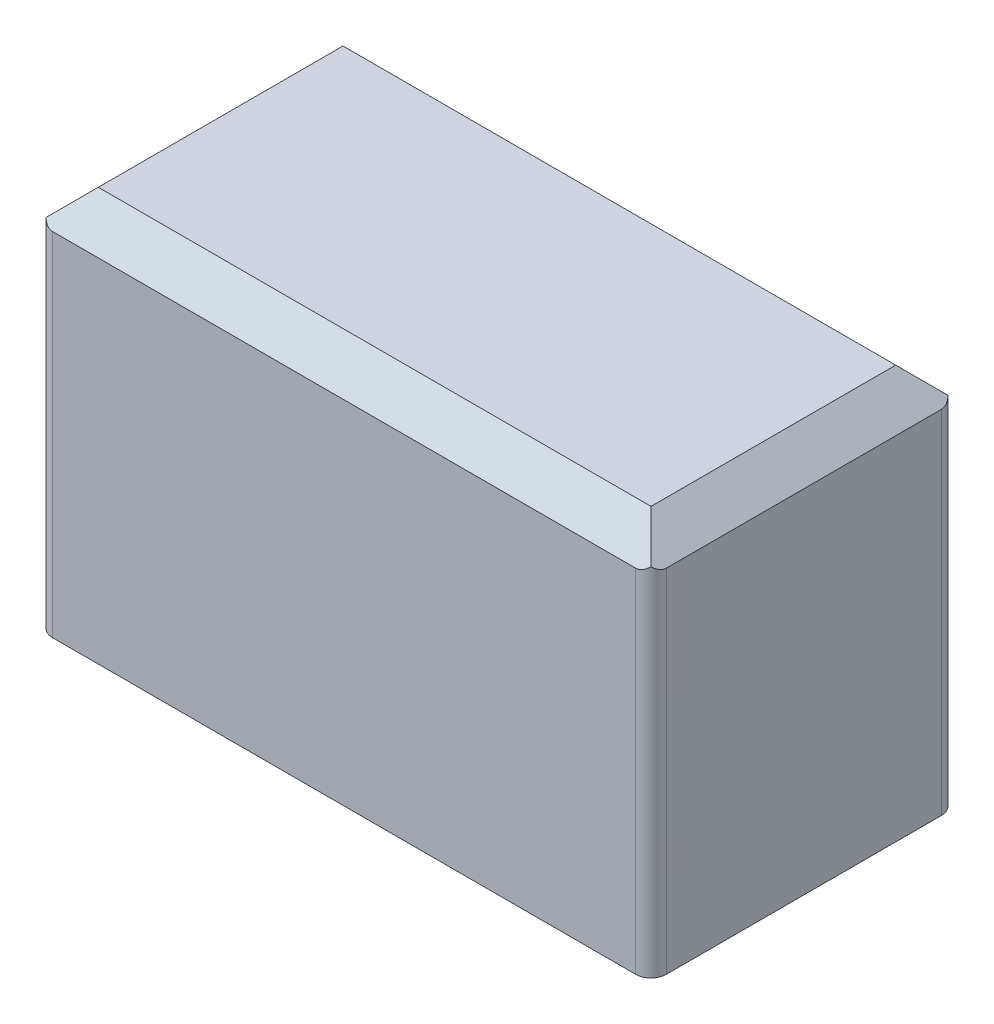
ISO-10303-21;
HEADER;
FILE_DESCRIPTION(('STEP AP214'),'2;1');
FILE_NAME('part.step','',(''),(''),'','','');
FILE_SCHEMA(('AUTOMOTIVE_DESIGN { 1 0 10303 214 1 1 1 1 }'));
ENDSEC;
DATA;
#1=APPLICATION_CONTEXT('core data for automotive mechanical design processes');
#2=APPLICATION_PROTOCOL_DEFINITION('international standard','automotive_design',2000,#1);
#3=PRODUCT_CONTEXT('',#1,'mechanical');
#4=PRODUCT('Part','Part','',(#3));
#5=PRODUCT_RELATED_PRODUCT_CATEGORY('part','',(#4));
#6=PRODUCT_DEFINITION_FORMATION('','',#4);
#7=PRODUCT_DEFINITION_CONTEXT('part definition',#1,'design');
#8=PRODUCT_DEFINITION('design','',#6,#7);
#9=PRODUCT_DEFINITION_SHAPE('','',#8);
#10=(LENGTH_UNIT() NAMED_UNIT(*) SI_UNIT(.MILLI.,.METRE.));
#11=(NAMED_UNIT(*) PLANE_ANGLE_UNIT() SI_UNIT($,.RADIAN.));
#12=(NAMED_UNIT(*) SI_UNIT($,.STERADIAN.) SOLID_ANGLE_UNIT());
#13=UNCERTAINTY_MEASURE_WITH_UNIT(LENGTH_MEASURE(1.E-05),#10,'distance_accuracy_value','');
#14=(GEOMETRIC_REPRESENTATION_CONTEXT(3) GLOBAL_UNCERTAINTY_ASSIGNED_CONTEXT((#13)) GLOBAL_UNIT_ASSIGNED_CONTEXT((#10,
#11,#12)) REPRESENTATION_CONTEXT('',''));
#15=CARTESIAN_POINT('',(0.,0.,0.));
#16=DIRECTION('',(0.,0.,1.));
#17=DIRECTION('',(1.,0.,0.));
#18=AXIS2_PLACEMENT_3D('',#15,#16,#17);
#19=CARTESIAN_POINT('',(0.,25.,0.));
#20=DIRECTION('',(1.,0.,0.));
#21=DIRECTION('',(0.,0.,-1.));
#22=AXIS2_PLACEMENT_3D('',#19,#20,#21);
#23=PLANE('',#22);
#24=DIRECTION('',(0.,0.,1.));
#25=VECTOR('',#24,1.);
#26=CARTESIAN_POINT('',(0.,0.,0.));
#27=LINE('',#26,#25);
#28=CARTESIAN_POINT('',(0.,0.,-19.));
#29=VERTEX_POINT('',#28);
#30=CARTESIAN_POINT('',(0.,0.,-1.));
#31=VERTEX_POINT('',#30);
#32=EDGE_CURVE('E181',#29,#31,#27,.T.);
#33=ORIENTED_EDGE('',*,*,#32,.T.);
#34=DIRECTION('',(0.,-1.,0.));
#35=VECTOR('',#34,1.);
#36=CARTESIAN_POINT('',(0.,25.,-1.));
#37=LINE('',#36,#35);
#38=CARTESIAN_POINT('',(0.,23.,-1.));
#39=VERTEX_POINT('',#38);
#40=EDGE_CURVE('E196',#31,#39,#37,.F.);
#41=ORIENTED_EDGE('',*,*,#40,.T.);
#42=DIRECTION('',(0.,0.,-1.));
#43=VECTOR('',#42,1.);
#44=CARTESIAN_POINT('',(0.,23.,0.));
#45=LINE('',#44,#43);
#46=CARTESIAN_POINT('',(0.,23.,-19.));
#47=VERTEX_POINT('',#46);
#48=EDGE_CURVE('E174',#39,#47,#45,.T.);
#49=ORIENTED_EDGE('',*,*,#48,.T.);
#50=DIRECTION('',(0.,-1.,0.));
#51=VECTOR('',#50,1.);
#52=CARTESIAN_POINT('',(0.,25.,-19.));
#53=LINE('',#52,#51);
#54=EDGE_CURVE('E192',#47,#29,#53,.T.);
#55=ORIENTED_EDGE('',*,*,#54,.T.);
#56=EDGE_LOOP('',(#33,#41,#49,#55));
#57=FACE_BOUND('',#56,.T.);
#58=ADVANCED_FACE('F38',(#57),#23,.F.);
#59=CARTESIAN_POINT('',(0.,25.,0.));
#60=DIRECTION('',(0.,0.,-1.));
#61=DIRECTION('',(-1.,0.,0.));
#62=AXIS2_PLACEMENT_3D('',#59,#60,#61);
#63=PLANE('',#62);
#64=DIRECTION('',(1.,0.,0.));
#65=VECTOR('',#64,1.);
#66=CARTESIAN_POINT('',(0.,0.,0.));
#67=LINE('',#66,#65);
#68=CARTESIAN_POINT('',(1.,0.,0.));
#69=VERTEX_POINT('',#68);
#70=CARTESIAN_POINT('',(39.1397843102462,0.,0.));
#71=VERTEX_POINT('',#70);
#72=EDGE_CURVE('E164',#69,#71,#67,.T.);
#73=ORIENTED_EDGE('',*,*,#72,.T.);
#74=DIRECTION('',(0.,-1.,0.));
#75=VECTOR('',#74,1.);
#76=CARTESIAN_POINT('',(39.1397843102462,25.,0.));
#77=LINE('',#76,#75);
#78=CARTESIAN_POINT('',(39.1397843102462,23.,0.));
#79=VERTEX_POINT('',#78);
#80=EDGE_CURVE('E226',#71,#79,#77,.F.);
#81=ORIENTED_EDGE('',*,*,#80,.T.);
#82=DIRECTION('',(-1.,0.,0.));
#83=VECTOR('',#82,1.);
#84=CARTESIAN_POINT('',(0.,23.,0.));
#85=LINE('',#84,#83);
#86=CARTESIAN_POINT('',(1.,23.,0.));
#87=VERTEX_POINT('',#86);
#88=EDGE_CURVE('E171',#79,#87,#85,.T.);
#89=ORIENTED_EDGE('',*,*,#88,.T.);
#90=DIRECTION('',(0.,-1.,0.));
#91=VECTOR('',#90,1.);
#92=CARTESIAN_POINT('',(1.,25.,0.));
#93=LINE('',#92,#91);
#94=EDGE_CURVE('E177',#87,#69,#93,.T.);
#95=ORIENTED_EDGE('',*,*,#94,.T.);
#96=EDGE_LOOP('',(#73,#81,#89,#95));
#97=FACE_BOUND('',#96,.T.);
#98=ADVANCED_FACE('F268',(#97),#63,.F.);
#99=CARTESIAN_POINT('',(0.,25.,-20.));
#100=DIRECTION('',(0.,0.,1.));
#101=DIRECTION('',(1.,0.,0.));
#102=AXIS2_PLACEMENT_3D('',#99,#100,#101);
#103=PLANE('',#102);
#104=DIRECTION('',(1.,0.,0.));
#105=VECTOR('',#104,1.);
#106=CARTESIAN_POINT('',(0.,23.,-20.));
#107=LINE('',#106,#105);
#108=CARTESIAN_POINT('',(1.,23.,-20.));
#109=VERTEX_POINT('',#108);
#110=CARTESIAN_POINT('',(39.1397843102462,23.,-20.));
#111=VERTEX_POINT('',#110);
#112=EDGE_CURVE('E140',#109,#111,#107,.T.);
#113=ORIENTED_EDGE('',*,*,#112,.T.);
#114=DIRECTION('',(0.,-1.,0.));
#115=VECTOR('',#114,1.);
#116=CARTESIAN_POINT('',(39.1397843102462,25.,-20.));
#117=LINE('',#116,#115);
#118=CARTESIAN_POINT('',(39.1397843102462,0.,-20.));
#119=VERTEX_POINT('',#118);
#120=EDGE_CURVE('E232',#111,#119,#117,.T.);
#121=ORIENTED_EDGE('',*,*,#120,.T.);
#122=DIRECTION('',(-1.,0.,0.));
#123=VECTOR('',#122,1.);
#124=CARTESIAN_POINT('',(0.,0.,-20.));
#125=LINE('',#124,#123);
#126=CARTESIAN_POINT('',(1.,0.,-20.));
#127=VERTEX_POINT('',#126);
#128=EDGE_CURVE('E159',#119,#127,#125,.T.);
#129=ORIENTED_EDGE('',*,*,#128,.T.);
#130=DIRECTION('',(0.,-1.,0.));
#131=VECTOR('',#130,1.);
#132=CARTESIAN_POINT('',(1.,25.,-20.));
#133=LINE('',#132,#131);
#134=EDGE_CURVE('E209',#127,#109,#133,.F.);
#135=ORIENTED_EDGE('',*,*,#134,.T.);
#136=EDGE_LOOP('',(#113,#121,#129,#135));
#137=FACE_BOUND('',#136,.T.);
#138=ADVANCED_FACE('F292',(#137),#103,.F.);
#139=CARTESIAN_POINT('',(0.,25.,0.));
#140=DIRECTION('',(0.,-1.,0.));
#141=DIRECTION('',(0.,0.,-1.));
#142=AXIS2_PLACEMENT_3D('',#139,#140,#141);
#143=PLANE('',#142);
#144=DIRECTION('',(1.,0.,0.));
#145=VECTOR('',#144,1.);
#146=CARTESIAN_POINT('',(0.,25.,-2.));
#147=LINE('',#146,#145);
#148=CARTESIAN_POINT('',(2.,25.,-2.));
#149=VERTEX_POINT('',#148);
#150=CARTESIAN_POINT('',(38.1397843102462,25.,-2.));
#151=VERTEX_POINT('',#150);
#152=EDGE_CURVE('E141',#149,#151,#147,.T.);
#153=ORIENTED_EDGE('',*,*,#152,.T.);
#154=DIRECTION('',(0.,0.,-1.));
#155=VECTOR('',#154,1.);
#156=CARTESIAN_POINT('',(38.1397843102462,25.,0.));
#157=LINE('',#156,#155);
#158=CARTESIAN_POINT('',(38.1397843102462,25.,-18.));
#159=VERTEX_POINT('',#158);
#160=EDGE_CURVE('E137',#151,#159,#157,.T.);
#161=ORIENTED_EDGE('',*,*,#160,.T.);
#162=DIRECTION('',(-1.,0.,0.));
#163=VECTOR('',#162,1.);
#164=CARTESIAN_POINT('',(0.,25.,-18.));
#165=LINE('',#164,#163);
#166=CARTESIAN_POINT('',(2.,25.,-18.));
#167=VERTEX_POINT('',#166);
#168=EDGE_CURVE('E129',#159,#167,#165,.T.);
#169=ORIENTED_EDGE('',*,*,#168,.T.);
#170=DIRECTION('',(0.,0.,1.));
#171=VECTOR('',#170,1.);
#172=CARTESIAN_POINT('',(2.,25.,0.));
#173=LINE('',#172,#171);
#174=EDGE_CURVE('E134',#167,#149,#173,.T.);
#175=ORIENTED_EDGE('',*,*,#174,.T.);
#176=EDGE_LOOP('',(#153,#161,#169,#175));
#177=FACE_BOUND('',#176,.T.);
#178=ADVANCED_FACE('F132',(#177),#143,.F.);
#179=CARTESIAN_POINT('',(0.,0.,0.));
#180=DIRECTION('',(0.,-1.,0.));
#181=DIRECTION('',(0.,0.,-1.));
#182=AXIS2_PLACEMENT_3D('',#179,#180,#181);
#183=PLANE('',#182);
#184=DIRECTION('',(0.,0.,-1.));
#185=VECTOR('',#184,1.);
#186=CARTESIAN_POINT('',(40.1397843102462,0.,0.));
#187=LINE('',#186,#185);
#188=CARTESIAN_POINT('',(40.1397843102462,0.,-1.));
#189=VERTEX_POINT('',#188);
#190=CARTESIAN_POINT('',(40.1397843102462,0.,-19.));
#191=VERTEX_POINT('',#190);
#192=EDGE_CURVE('E153',#189,#191,#187,.T.);
#193=ORIENTED_EDGE('',*,*,#192,.F.);
#194=CARTESIAN_POINT('',(39.1397843102462,0.,-1.));
#195=DIRECTION('',(0.,-1.,0.));
#196=DIRECTION('',(0.,0.,-1.));
#197=AXIS2_PLACEMENT_3D('',#194,#195,#196);
#198=CIRCLE('',#197,1.);
#199=EDGE_CURVE('E223',#189,#71,#198,.T.);
#200=ORIENTED_EDGE('',*,*,#199,.T.);
#201=ORIENTED_EDGE('',*,*,#72,.F.);
#202=CARTESIAN_POINT('',(1.,0.,-1.));
#203=DIRECTION('',(0.,-1.,0.));
#204=DIRECTION('',(0.,0.,-1.));
#205=AXIS2_PLACEMENT_3D('',#202,#203,#204);
#206=CIRCLE('',#205,1.);
#207=EDGE_CURVE('E189',#69,#31,#206,.T.);
#208=ORIENTED_EDGE('',*,*,#207,.T.);
#209=ORIENTED_EDGE('',*,*,#32,.F.);
#210=CARTESIAN_POINT('',(1.,0.,-19.));
#211=DIRECTION('',(0.,-1.,0.));
#212=DIRECTION('',(0.,0.,-1.));
#213=AXIS2_PLACEMENT_3D('',#210,#211,#212);
#214=CIRCLE('',#213,1.);
#215=EDGE_CURVE('E185',#29,#127,#214,.T.);
#216=ORIENTED_EDGE('',*,*,#215,.T.);
#217=ORIENTED_EDGE('',*,*,#128,.F.);
#218=CARTESIAN_POINT('',(39.1397843102462,0.,-19.));
#219=DIRECTION('',(0.,-1.,0.));
#220=DIRECTION('',(0.,0.,-1.));
#221=AXIS2_PLACEMENT_3D('',#218,#219,#220);
#222=CIRCLE('',#221,1.);
#223=EDGE_CURVE('E220',#119,#191,#222,.T.);
#224=ORIENTED_EDGE('',*,*,#223,.T.);
#225=EDGE_LOOP('',(#193,#200,#201,#208,#209,#216,#217,#224));
#226=FACE_BOUND('',#225,.T.);
#227=ADVANCED_FACE('F290',(#226),#183,.T.);
#228=CARTESIAN_POINT('',(0.,25.,-2.));
#229=DIRECTION('',(0.,-0.707106781186547,-0.707106781186548));
#230=DIRECTION('',(1.,0.,0.));
#231=AXIS2_PLACEMENT_3D('',#228,#229,#230);
#232=PLANE('',#231);
#233=CARTESIAN_POINT('',(39.1397843102462,24.,-1.));
#234=DIRECTION('',(0.,-0.707106781186547,-0.707106781186548));
#235=DIRECTION('',(0.,-0.707106781186548,0.707106781186547));
#236=AXIS2_PLACEMENT_3D('',#233,#234,#235);
#237=ELLIPSE('',#236,1.4142135623731,1.);
#238=CARTESIAN_POINT('',(39.8468910914328,23.2928932188134,-0.292893218813449));
#239=VERTEX_POINT('',#238);
#240=EDGE_CURVE('E229',#79,#239,#237,.F.);
#241=ORIENTED_EDGE('',*,*,#240,.T.);
#242=DIRECTION('',(-0.577350269189625,0.577350269189627,-0.577350269189626));
#243=VECTOR('',#242,1.);
#244=CARTESIAN_POINT('',(25.4265228734976,37.7132614367487,-14.7132614367487));
#245=LINE('',#244,#243);
#246=EDGE_CURVE('E11',#239,#151,#245,.T.);
#247=ORIENTED_EDGE('',*,*,#246,.T.);
#248=ORIENTED_EDGE('',*,*,#152,.F.);
#249=DIRECTION('',(0.577350269189626,0.577350269189626,-0.577350269189626));
#250=VECTOR('',#249,1.);
#251=CARTESIAN_POINT('',(1.33333333333334,24.3333333333333,-1.33333333333333));
#252=LINE('',#251,#250);
#253=CARTESIAN_POINT('',(0.292893218813452,23.2928932188135,-0.292893218813452));
#254=VERTEX_POINT('',#253);
#255=EDGE_CURVE('E152',#254,#149,#252,.T.);
#256=ORIENTED_EDGE('',*,*,#255,.F.);
#257=CARTESIAN_POINT('',(1.,24.,-1.));
#258=DIRECTION('',(0.,-0.707106781186547,-0.707106781186548));
#259=DIRECTION('',(0.,-0.707106781186548,0.707106781186547));
#260=AXIS2_PLACEMENT_3D('',#257,#258,#259);
#261=ELLIPSE('',#260,1.4142135623731,1.);
#262=EDGE_CURVE('E205',#254,#87,#261,.F.);
#263=ORIENTED_EDGE('',*,*,#262,.T.);
#264=ORIENTED_EDGE('',*,*,#88,.F.);
#265=EDGE_LOOP('',(#241,#247,#248,#256,#263,#264));
#266=FACE_BOUND('',#265,.T.);
#267=ADVANCED_FACE('F261',(#266),#232,.F.);
#268=CARTESIAN_POINT('',(2.,25.,0.));
#269=DIRECTION('',(0.707106781186547,-0.707106781186547,0.));
#270=DIRECTION('',(0.,0.,1.));
#271=AXIS2_PLACEMENT_3D('',#268,#269,#270);
#272=PLANE('',#271);
#273=ORIENTED_EDGE('',*,*,#48,.F.);
#274=CARTESIAN_POINT('',(1.,24.,-1.));
#275=DIRECTION('',(0.707106781186547,-0.707106781186547,0.));
#276=DIRECTION('',(-0.707106781186548,-0.707106781186548,0.));
#277=AXIS2_PLACEMENT_3D('',#274,#275,#276);
#278=ELLIPSE('',#277,1.4142135623731,1.);
#279=EDGE_CURVE('E202',#39,#254,#278,.F.);
#280=ORIENTED_EDGE('',*,*,#279,.T.);
#281=ORIENTED_EDGE('',*,*,#255,.T.);
#282=ORIENTED_EDGE('',*,*,#174,.F.);
#283=DIRECTION('',(-0.577350269189626,-0.577350269189626,-0.577350269189626));
#284=VECTOR('',#283,1.);
#285=CARTESIAN_POINT('',(8.,31.,-12.));
#286=LINE('',#285,#284);
#287=CARTESIAN_POINT('',(0.292893218813458,23.2928932188135,-19.7071067811865));
#288=VERTEX_POINT('',#287);
#289=EDGE_CURVE('E144',#288,#167,#286,.F.);
#290=ORIENTED_EDGE('',*,*,#289,.F.);
#291=CARTESIAN_POINT('',(1.,24.,-19.));
#292=DIRECTION('',(0.707106781186547,-0.707106781186547,0.));
#293=DIRECTION('',(-0.707106781186548,-0.707106781186548,0.));
#294=AXIS2_PLACEMENT_3D('',#291,#292,#293);
#295=ELLIPSE('',#294,1.4142135623731,1.);
#296=EDGE_CURVE('E199',#288,#47,#295,.F.);
#297=ORIENTED_EDGE('',*,*,#296,.T.);
#298=EDGE_LOOP('',(#273,#280,#281,#282,#290,#297));
#299=FACE_BOUND('',#298,.T.);
#300=ADVANCED_FACE('F156',(#299),#272,.F.);
#301=CARTESIAN_POINT('',(0.,25.,-18.));
#302=DIRECTION('',(0.,-0.707106781186547,0.707106781186547));
#303=DIRECTION('',(-1.,0.,0.));
#304=AXIS2_PLACEMENT_3D('',#301,#302,#303);
#305=PLANE('',#304);
#306=ORIENTED_EDGE('',*,*,#168,.F.);
#307=DIRECTION('',(0.577350269189624,-0.577350269189626,-0.577350269189626));
#308=VECTOR('',#307,1.);
#309=CARTESIAN_POINT('',(25.4265228734976,37.7132614367487,-5.28673856325127));
#310=LINE('',#309,#308);
#311=CARTESIAN_POINT('',(39.8468910914328,23.2928932188134,-19.7071067811866));
#312=VERTEX_POINT('',#311);
#313=EDGE_CURVE('E241',#159,#312,#310,.T.);
#314=ORIENTED_EDGE('',*,*,#313,.T.);
#315=CARTESIAN_POINT('',(39.1397843102462,24.,-19.));
#316=DIRECTION('',(0.,-0.707106781186547,0.707106781186547));
#317=DIRECTION('',(0.,-0.707106781186548,-0.707106781186548));
#318=AXIS2_PLACEMENT_3D('',#315,#316,#317);
#319=ELLIPSE('',#318,1.4142135623731,1.);
#320=EDGE_CURVE('E236',#312,#111,#319,.F.);
#321=ORIENTED_EDGE('',*,*,#320,.T.);
#322=ORIENTED_EDGE('',*,*,#112,.F.);
#323=CARTESIAN_POINT('',(1.,24.,-19.));
#324=DIRECTION('',(0.,-0.707106781186547,0.707106781186547));
#325=DIRECTION('',(0.,-0.707106781186548,-0.707106781186548));
#326=AXIS2_PLACEMENT_3D('',#323,#324,#325);
#327=ELLIPSE('',#326,1.4142135623731,1.);
#328=EDGE_CURVE('E148',#109,#288,#327,.F.);
#329=ORIENTED_EDGE('',*,*,#328,.T.);
#330=ORIENTED_EDGE('',*,*,#289,.T.);
#331=EDGE_LOOP('',(#306,#314,#321,#322,#329,#330));
#332=FACE_BOUND('',#331,.T.);
#333=ADVANCED_FACE('F145',(#332),#305,.F.);
#334=CARTESIAN_POINT('',(1.,25.,-1.));
#335=DIRECTION('',(0.,-1.,0.));
#336=DIRECTION('',(0.,0.,-1.));
#337=AXIS2_PLACEMENT_3D('',#334,#335,#336);
#338=CYLINDRICAL_SURFACE('',#337,1.);
#339=ORIENTED_EDGE('',*,*,#279,.F.);
#340=ORIENTED_EDGE('',*,*,#40,.F.);
#341=ORIENTED_EDGE('',*,*,#207,.F.);
#342=ORIENTED_EDGE('',*,*,#94,.F.);
#343=ORIENTED_EDGE('',*,*,#262,.F.);
#344=EDGE_LOOP('',(#339,#340,#341,#342,#343));
#345=FACE_BOUND('',#344,.T.);
#346=ADVANCED_FACE('F284',(#345),#338,.T.);
#347=CARTESIAN_POINT('',(1.,25.,-19.));
#348=DIRECTION('',(0.,-1.,0.));
#349=DIRECTION('',(0.,0.,-1.));
#350=AXIS2_PLACEMENT_3D('',#347,#348,#349);
#351=CYLINDRICAL_SURFACE('',#350,1.);
#352=ORIENTED_EDGE('',*,*,#328,.F.);
#353=ORIENTED_EDGE('',*,*,#134,.F.);
#354=ORIENTED_EDGE('',*,*,#215,.F.);
#355=ORIENTED_EDGE('',*,*,#54,.F.);
#356=ORIENTED_EDGE('',*,*,#296,.F.);
#357=EDGE_LOOP('',(#352,#353,#354,#355,#356));
#358=FACE_BOUND('',#357,.T.);
#359=ADVANCED_FACE('F287',(#358),#351,.T.);
#360=CARTESIAN_POINT('',(40.1397843102462,40.,0.));
#361=DIRECTION('',(-1.,0.,0.));
#362=DIRECTION('',(0.,0.,1.));
#363=AXIS2_PLACEMENT_3D('',#360,#361,#362);
#364=PLANE('',#363);
#365=DIRECTION('',(0.,-1.,0.));
#366=VECTOR('',#365,1.);
#367=CARTESIAN_POINT('',(40.1397843102462,40.,-19.));
#368=LINE('',#367,#366);
#369=CARTESIAN_POINT('',(40.1397843102462,23.,-19.));
#370=VERTEX_POINT('',#369);
#371=EDGE_CURVE('E214',#191,#370,#368,.F.);
#372=ORIENTED_EDGE('',*,*,#371,.T.);
#373=DIRECTION('',(0.,0.,1.));
#374=VECTOR('',#373,1.);
#375=CARTESIAN_POINT('',(40.1397843102462,23.,0.));
#376=LINE('',#375,#374);
#377=CARTESIAN_POINT('',(40.1397843102462,23.,-1.));
#378=VERTEX_POINT('',#377);
#379=EDGE_CURVE('E61',#370,#378,#376,.T.);
#380=ORIENTED_EDGE('',*,*,#379,.T.);
#381=DIRECTION('',(0.,-1.,0.));
#382=VECTOR('',#381,1.);
#383=CARTESIAN_POINT('',(40.1397843102462,40.,-1.));
#384=LINE('',#383,#382);
#385=EDGE_CURVE('E217',#378,#189,#384,.T.);
#386=ORIENTED_EDGE('',*,*,#385,.T.);
#387=ORIENTED_EDGE('',*,*,#192,.T.);
#388=EDGE_LOOP('',(#372,#380,#386,#387));
#389=FACE_BOUND('',#388,.T.);
#390=ADVANCED_FACE('F257',(#389),#364,.F.);
#391=CARTESIAN_POINT('',(39.1397843102462,40.,-1.));
#392=DIRECTION('',(0.,-1.,0.));
#393=DIRECTION('',(0.,0.,-1.));
#394=AXIS2_PLACEMENT_3D('',#391,#392,#393);
#395=CYLINDRICAL_SURFACE('',#394,1.);
#396=ORIENTED_EDGE('',*,*,#385,.F.);
#397=CARTESIAN_POINT('',(39.1397843102462,24.,-1.));
#398=DIRECTION('',(-0.707106781186549,-0.707106781186546,0.));
#399=DIRECTION('',(0.707106781186546,-0.707106781186549,0.));
#400=AXIS2_PLACEMENT_3D('',#397,#398,#399);
#401=ELLIPSE('',#400,1.4142135623731,1.);
#402=EDGE_CURVE('E47',#378,#239,#401,.T.);
#403=ORIENTED_EDGE('',*,*,#402,.T.);
#404=ORIENTED_EDGE('',*,*,#240,.F.);
#405=ORIENTED_EDGE('',*,*,#80,.F.);
#406=ORIENTED_EDGE('',*,*,#199,.F.);
#407=EDGE_LOOP('',(#396,#403,#404,#405,#406));
#408=FACE_BOUND('',#407,.T.);
#409=ADVANCED_FACE('F264',(#408),#395,.T.);
#410=CARTESIAN_POINT('',(39.1397843102462,25.,-19.));
#411=DIRECTION('',(0.,-1.,0.));
#412=DIRECTION('',(0.,0.,-1.));
#413=AXIS2_PLACEMENT_3D('',#410,#411,#412);
#414=CYLINDRICAL_SURFACE('',#413,1.);
#415=ORIENTED_EDGE('',*,*,#320,.F.);
#416=CARTESIAN_POINT('',(39.1397843102462,24.,-19.));
#417=DIRECTION('',(-0.707106781186549,-0.707106781186546,0.));
#418=DIRECTION('',(0.707106781186546,-0.707106781186549,0.));
#419=AXIS2_PLACEMENT_3D('',#416,#417,#418);
#420=ELLIPSE('',#419,1.4142135623731,1.);
#421=EDGE_CURVE('E244',#312,#370,#420,.T.);
#422=ORIENTED_EDGE('',*,*,#421,.T.);
#423=ORIENTED_EDGE('',*,*,#371,.F.);
#424=ORIENTED_EDGE('',*,*,#223,.F.);
#425=ORIENTED_EDGE('',*,*,#120,.F.);
#426=EDGE_LOOP('',(#415,#422,#423,#424,#425));
#427=FACE_BOUND('',#426,.T.);
#428=ADVANCED_FACE('F253',(#427),#414,.T.);
#429=CARTESIAN_POINT('',(38.1397843102462,25.,0.));
#430=DIRECTION('',(-0.707106781186549,-0.707106781186546,0.));
#431=DIRECTION('',(0.,0.,-1.));
#432=AXIS2_PLACEMENT_3D('',#429,#430,#431);
#433=PLANE('',#432);
#434=ORIENTED_EDGE('',*,*,#402,.F.);
#435=ORIENTED_EDGE('',*,*,#379,.F.);
#436=ORIENTED_EDGE('',*,*,#421,.F.);
#437=ORIENTED_EDGE('',*,*,#313,.F.);
#438=ORIENTED_EDGE('',*,*,#160,.F.);
#439=ORIENTED_EDGE('',*,*,#246,.F.);
#440=EDGE_LOOP('',(#434,#435,#436,#437,#438,#439));
#441=FACE_BOUND('',#440,.T.);
#442=ADVANCED_FACE('F40',(#441),#433,.F.);
#443=CLOSED_SHELL('',(#58,#98,#138,#178,#227,#267,#300,#333,#346,#359,#390,#409,#428,#442));
#444=MANIFOLD_SOLID_BREP('B2',#443);
#445=ADVANCED_BREP_SHAPE_REPRESENTATION('',(#18,#444),#14);
#446=SHAPE_DEFINITION_REPRESENTATION(#9,#445);
ENDSEC;
END-ISO-10303-21;
